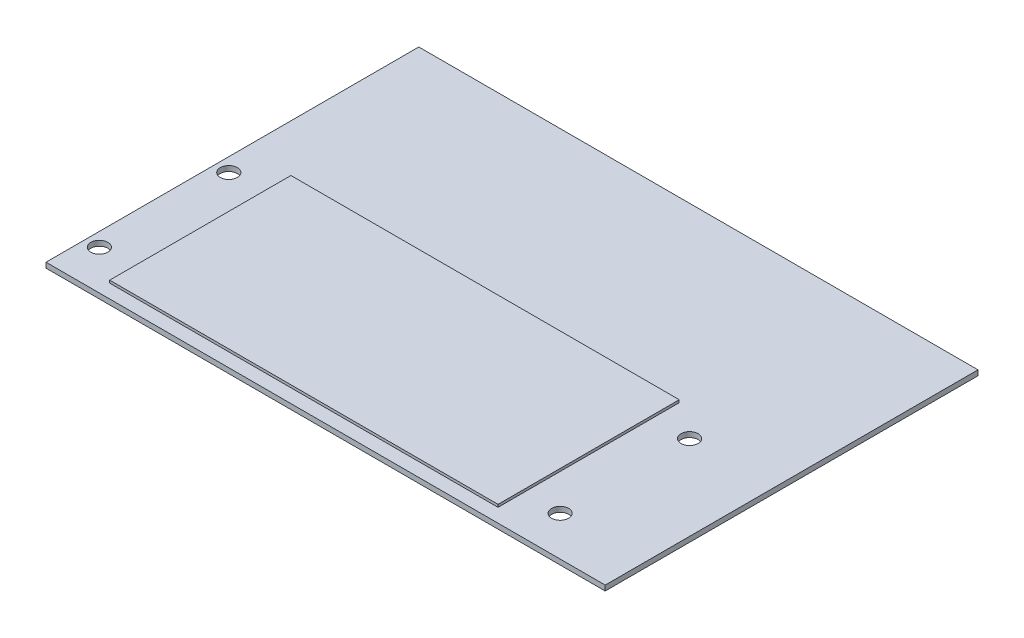
ISO-10303-21;
HEADER;
FILE_DESCRIPTION(('STEP AP214'),'2;1');
FILE_NAME('part.step','',(''),(''),'','','');
FILE_SCHEMA(('AUTOMOTIVE_DESIGN { 1 0 10303 214 1 1 1 1 }'));
ENDSEC;
DATA;
#1=APPLICATION_CONTEXT('core data for automotive mechanical design processes');
#2=APPLICATION_PROTOCOL_DEFINITION('international standard','automotive_design',2000,#1);
#3=PRODUCT_CONTEXT('',#1,'mechanical');
#4=PRODUCT('Part','Part','',(#3));
#5=PRODUCT_RELATED_PRODUCT_CATEGORY('part','',(#4));
#6=PRODUCT_DEFINITION_FORMATION('','',#4);
#7=PRODUCT_DEFINITION_CONTEXT('part definition',#1,'design');
#8=PRODUCT_DEFINITION('design','',#6,#7);
#9=PRODUCT_DEFINITION_SHAPE('','',#8);
#10=(LENGTH_UNIT() NAMED_UNIT(*) SI_UNIT(.MILLI.,.METRE.));
#11=(NAMED_UNIT(*) PLANE_ANGLE_UNIT() SI_UNIT($,.RADIAN.));
#12=(NAMED_UNIT(*) SI_UNIT($,.STERADIAN.) SOLID_ANGLE_UNIT());
#13=UNCERTAINTY_MEASURE_WITH_UNIT(LENGTH_MEASURE(1.E-05),#10,'distance_accuracy_value','');
#14=(GEOMETRIC_REPRESENTATION_CONTEXT(3) GLOBAL_UNCERTAINTY_ASSIGNED_CONTEXT((#13)) GLOBAL_UNIT_ASSIGNED_CONTEXT((#10,
#11,#12)) REPRESENTATION_CONTEXT('',''));
#15=CARTESIAN_POINT('',(0.,0.,0.));
#16=DIRECTION('',(0.,0.,1.));
#17=DIRECTION('',(1.,0.,0.));
#18=AXIS2_PLACEMENT_3D('',#15,#16,#17);
#19=CARTESIAN_POINT('',(0.,1.,0.));
#20=DIRECTION('',(0.,1.,0.));
#21=DIRECTION('',(0.,0.,1.));
#22=AXIS2_PLACEMENT_3D('',#19,#20,#21);
#23=PLANE('',#22);
#24=CARTESIAN_POINT('',(44.5,1.,-12.5));
#25=DIRECTION('',(0.,1.,0.));
#26=DIRECTION('',(0.,0.,1.));
#27=AXIS2_PLACEMENT_3D('',#24,#25,#26);
#28=CIRCLE('',#27,1.65);
#29=CARTESIAN_POINT('',(44.5,1.,-10.85));
#30=VERTEX_POINT('',#29);
#31=EDGE_CURVE('E146',#30,#30,#28,.T.);
#32=ORIENTED_EDGE('',*,*,#31,.F.);
#33=EDGE_LOOP('',(#32));
#34=FACE_BOUND('',#33,.T.);
#35=CARTESIAN_POINT('',(-44.5,1.,-12.5));
#36=DIRECTION('',(0.,1.,0.));
#37=DIRECTION('',(0.,0.,1.));
#38=AXIS2_PLACEMENT_3D('',#35,#36,#37);
#39=CIRCLE('',#38,1.65);
#40=CARTESIAN_POINT('',(-44.5,1.,-10.85));
#41=VERTEX_POINT('',#40);
#42=EDGE_CURVE('E158',#41,#41,#39,.T.);
#43=ORIENTED_EDGE('',*,*,#42,.F.);
#44=EDGE_LOOP('',(#43));
#45=FACE_BOUND('',#44,.T.);
#46=DIRECTION('',(0.,0.,1.));
#47=VECTOR('',#46,1.);
#48=CARTESIAN_POINT('',(-47.15,1.,-51.85));
#49=LINE('',#48,#47);
#50=CARTESIAN_POINT('',(-47.15,1.,-51.85));
#51=VERTEX_POINT('',#50);
#52=CARTESIAN_POINT('',(-47.15,1.,20.15));
#53=VERTEX_POINT('',#52);
#54=EDGE_CURVE('E164',#51,#53,#49,.T.);
#55=ORIENTED_EDGE('',*,*,#54,.T.);
#56=DIRECTION('',(1.,0.,0.));
#57=VECTOR('',#56,1.);
#58=CARTESIAN_POINT('',(-47.15,1.,20.15));
#59=LINE('',#58,#57);
#60=CARTESIAN_POINT('',(60.85,1.,20.15));
#61=VERTEX_POINT('',#60);
#62=EDGE_CURVE('E88',#53,#61,#59,.T.);
#63=ORIENTED_EDGE('',*,*,#62,.T.);
#64=DIRECTION('',(0.,0.,-1.));
#65=VECTOR('',#64,1.);
#66=CARTESIAN_POINT('',(60.85,1.,-51.85));
#67=LINE('',#66,#65);
#68=CARTESIAN_POINT('',(60.85,1.,-51.85));
#69=VERTEX_POINT('',#68);
#70=EDGE_CURVE('E167',#61,#69,#67,.T.);
#71=ORIENTED_EDGE('',*,*,#70,.T.);
#72=DIRECTION('',(-1.,0.,0.));
#73=VECTOR('',#72,1.);
#74=CARTESIAN_POINT('',(-47.15,1.,-51.85));
#75=LINE('',#74,#73);
#76=EDGE_CURVE('E60',#69,#51,#75,.T.);
#77=ORIENTED_EDGE('',*,*,#76,.T.);
#78=EDGE_LOOP('',(#55,#63,#71,#77));
#79=FACE_BOUND('',#78,.T.);
#80=CARTESIAN_POINT('',(-44.5,1.,12.5));
#81=DIRECTION('',(0.,1.,0.));
#82=DIRECTION('',(0.,0.,1.));
#83=AXIS2_PLACEMENT_3D('',#80,#81,#82);
#84=CIRCLE('',#83,1.64999999999999);
#85=CARTESIAN_POINT('',(-44.5,1.,14.15));
#86=VERTEX_POINT('',#85);
#87=EDGE_CURVE('E152',#86,#86,#84,.T.);
#88=ORIENTED_EDGE('',*,*,#87,.F.);
#89=EDGE_LOOP('',(#88));
#90=FACE_BOUND('',#89,.T.);
#91=CARTESIAN_POINT('',(44.5,1.,12.5));
#92=DIRECTION('',(0.,1.,0.));
#93=DIRECTION('',(0.,0.,1.));
#94=AXIS2_PLACEMENT_3D('',#91,#92,#93);
#95=CIRCLE('',#94,1.64999999999999);
#96=CARTESIAN_POINT('',(44.5,1.,14.15));
#97=VERTEX_POINT('',#96);
#98=EDGE_CURVE('E138',#97,#97,#95,.T.);
#99=ORIENTED_EDGE('',*,*,#98,.F.);
#100=EDGE_LOOP('',(#99));
#101=FACE_BOUND('',#100,.T.);
#102=DIRECTION('',(1.,0.,0.));
#103=VECTOR('',#102,1.);
#104=CARTESIAN_POINT('',(37.5,1.,17.5));
#105=LINE('',#104,#103);
#106=CARTESIAN_POINT('',(-37.5,1.,17.5));
#107=VERTEX_POINT('',#106);
#108=CARTESIAN_POINT('',(37.5,1.,17.5));
#109=VERTEX_POINT('',#108);
#110=EDGE_CURVE('E334',#107,#109,#105,.T.);
#111=ORIENTED_EDGE('',*,*,#110,.F.);
#112=DIRECTION('',(0.,0.,1.));
#113=VECTOR('',#112,1.);
#114=CARTESIAN_POINT('',(-37.5,1.,-17.5));
#115=LINE('',#114,#113);
#116=CARTESIAN_POINT('',(-37.5,1.,-17.5));
#117=VERTEX_POINT('',#116);
#118=EDGE_CURVE('E133',#117,#107,#115,.T.);
#119=ORIENTED_EDGE('',*,*,#118,.F.);
#120=DIRECTION('',(-1.,0.,0.));
#121=VECTOR('',#120,1.);
#122=CARTESIAN_POINT('',(37.5,1.,-17.5));
#123=LINE('',#122,#121);
#124=CARTESIAN_POINT('',(37.5,1.,-17.5));
#125=VERTEX_POINT('',#124);
#126=EDGE_CURVE('E129',#125,#117,#123,.T.);
#127=ORIENTED_EDGE('',*,*,#126,.F.);
#128=DIRECTION('',(0.,0.,-1.));
#129=VECTOR('',#128,1.);
#130=CARTESIAN_POINT('',(37.5,1.,-17.5));
#131=LINE('',#130,#129);
#132=EDGE_CURVE('E331',#109,#125,#131,.T.);
#133=ORIENTED_EDGE('',*,*,#132,.F.);
#134=EDGE_LOOP('',(#111,#119,#127,#133));
#135=FACE_BOUND('',#134,.T.);
#136=ADVANCED_FACE('F36',(#34,#45,#79,#90,#101,#135),#23,.T.);
#137=CARTESIAN_POINT('',(0.,0.,0.));
#138=DIRECTION('',(0.,1.,0.));
#139=DIRECTION('',(0.,0.,1.));
#140=AXIS2_PLACEMENT_3D('',#137,#138,#139);
#141=PLANE('',#140);
#142=DIRECTION('',(0.,0.,1.));
#143=VECTOR('',#142,1.);
#144=CARTESIAN_POINT('',(-47.15,0.,-51.85));
#145=LINE('',#144,#143);
#146=CARTESIAN_POINT('',(-47.15,0.,-51.85));
#147=VERTEX_POINT('',#146);
#148=CARTESIAN_POINT('',(-47.15,0.,20.15));
#149=VERTEX_POINT('',#148);
#150=EDGE_CURVE('E161',#147,#149,#145,.T.);
#151=ORIENTED_EDGE('',*,*,#150,.F.);
#152=DIRECTION('',(-1.,0.,0.));
#153=VECTOR('',#152,1.);
#154=CARTESIAN_POINT('',(-47.15,0.,-51.85));
#155=LINE('',#154,#153);
#156=CARTESIAN_POINT('',(60.85,0.,-51.85));
#157=VERTEX_POINT('',#156);
#158=EDGE_CURVE('E81',#157,#147,#155,.T.);
#159=ORIENTED_EDGE('',*,*,#158,.F.);
#160=DIRECTION('',(0.,0.,-1.));
#161=VECTOR('',#160,1.);
#162=CARTESIAN_POINT('',(60.85,0.,-51.85));
#163=LINE('',#162,#161);
#164=CARTESIAN_POINT('',(60.85,0.,20.15));
#165=VERTEX_POINT('',#164);
#166=EDGE_CURVE('E175',#165,#157,#163,.T.);
#167=ORIENTED_EDGE('',*,*,#166,.F.);
#168=DIRECTION('',(1.,0.,0.));
#169=VECTOR('',#168,1.);
#170=CARTESIAN_POINT('',(-47.15,0.,20.15));
#171=LINE('',#170,#169);
#172=EDGE_CURVE('E173',#149,#165,#171,.T.);
#173=ORIENTED_EDGE('',*,*,#172,.F.);
#174=EDGE_LOOP('',(#151,#159,#167,#173));
#175=FACE_BOUND('',#174,.T.);
#176=CARTESIAN_POINT('',(-44.5,0.,-12.5));
#177=DIRECTION('',(0.,1.,0.));
#178=DIRECTION('',(0.,0.,1.));
#179=AXIS2_PLACEMENT_3D('',#176,#177,#178);
#180=CIRCLE('',#179,1.65);
#181=CARTESIAN_POINT('',(-44.5,0.,-10.85));
#182=VERTEX_POINT('',#181);
#183=EDGE_CURVE('E155',#182,#182,#180,.T.);
#184=ORIENTED_EDGE('',*,*,#183,.T.);
#185=EDGE_LOOP('',(#184));
#186=FACE_BOUND('',#185,.T.);
#187=CARTESIAN_POINT('',(-44.5,0.,12.5));
#188=DIRECTION('',(0.,1.,0.));
#189=DIRECTION('',(0.,0.,1.));
#190=AXIS2_PLACEMENT_3D('',#187,#188,#189);
#191=CIRCLE('',#190,1.64999999999999);
#192=CARTESIAN_POINT('',(-44.5,0.,14.15));
#193=VERTEX_POINT('',#192);
#194=EDGE_CURVE('E149',#193,#193,#191,.T.);
#195=ORIENTED_EDGE('',*,*,#194,.T.);
#196=EDGE_LOOP('',(#195));
#197=FACE_BOUND('',#196,.T.);
#198=CARTESIAN_POINT('',(44.5,0.,-12.5));
#199=DIRECTION('',(0.,1.,0.));
#200=DIRECTION('',(0.,0.,1.));
#201=AXIS2_PLACEMENT_3D('',#198,#199,#200);
#202=CIRCLE('',#201,1.65);
#203=CARTESIAN_POINT('',(44.5,0.,-10.85));
#204=VERTEX_POINT('',#203);
#205=EDGE_CURVE('E144',#204,#204,#202,.T.);
#206=ORIENTED_EDGE('',*,*,#205,.T.);
#207=EDGE_LOOP('',(#206));
#208=FACE_BOUND('',#207,.T.);
#209=CARTESIAN_POINT('',(44.5,0.,12.5));
#210=DIRECTION('',(0.,1.,0.));
#211=DIRECTION('',(0.,0.,1.));
#212=AXIS2_PLACEMENT_3D('',#209,#210,#211);
#213=CIRCLE('',#212,1.64999999999999);
#214=CARTESIAN_POINT('',(44.5,0.,14.15));
#215=VERTEX_POINT('',#214);
#216=EDGE_CURVE('E135',#215,#215,#213,.T.);
#217=ORIENTED_EDGE('',*,*,#216,.T.);
#218=EDGE_LOOP('',(#217));
#219=FACE_BOUND('',#218,.T.);
#220=ADVANCED_FACE('F188',(#175,#186,#197,#208,#219),#141,.F.);
#221=CARTESIAN_POINT('',(-47.15,1.,-51.85));
#222=DIRECTION('',(1.,0.,0.));
#223=DIRECTION('',(0.,0.,-1.));
#224=AXIS2_PLACEMENT_3D('',#221,#222,#223);
#225=PLANE('',#224);
#226=ORIENTED_EDGE('',*,*,#150,.T.);
#227=DIRECTION('',(0.,-1.,0.));
#228=VECTOR('',#227,1.);
#229=CARTESIAN_POINT('',(-47.15,1.,20.15));
#230=LINE('',#229,#228);
#231=EDGE_CURVE('E11',#53,#149,#230,.T.);
#232=ORIENTED_EDGE('',*,*,#231,.F.);
#233=ORIENTED_EDGE('',*,*,#54,.F.);
#234=DIRECTION('',(0.,-1.,0.));
#235=VECTOR('',#234,1.);
#236=CARTESIAN_POINT('',(-47.15,1.,-51.85));
#237=LINE('',#236,#235);
#238=EDGE_CURVE('E170',#51,#147,#237,.T.);
#239=ORIENTED_EDGE('',*,*,#238,.T.);
#240=EDGE_LOOP('',(#226,#232,#233,#239));
#241=FACE_BOUND('',#240,.T.);
#242=ADVANCED_FACE('F38',(#241),#225,.F.);
#243=CARTESIAN_POINT('',(-47.15,1.,20.15));
#244=DIRECTION('',(0.,0.,-1.));
#245=DIRECTION('',(-1.,0.,0.));
#246=AXIS2_PLACEMENT_3D('',#243,#244,#245);
#247=PLANE('',#246);
#248=ORIENTED_EDGE('',*,*,#172,.T.);
#249=DIRECTION('',(0.,-1.,0.));
#250=VECTOR('',#249,1.);
#251=CARTESIAN_POINT('',(60.85,1.,20.15));
#252=LINE('',#251,#250);
#253=EDGE_CURVE('E44',#61,#165,#252,.T.);
#254=ORIENTED_EDGE('',*,*,#253,.F.);
#255=ORIENTED_EDGE('',*,*,#62,.F.);
#256=ORIENTED_EDGE('',*,*,#231,.T.);
#257=EDGE_LOOP('',(#248,#254,#255,#256));
#258=FACE_BOUND('',#257,.T.);
#259=ADVANCED_FACE('F204',(#258),#247,.F.);
#260=CARTESIAN_POINT('',(60.85,1.,-51.85));
#261=DIRECTION('',(-1.,0.,0.));
#262=DIRECTION('',(0.,0.,1.));
#263=AXIS2_PLACEMENT_3D('',#260,#261,#262);
#264=PLANE('',#263);
#265=ORIENTED_EDGE('',*,*,#166,.T.);
#266=DIRECTION('',(0.,-1.,0.));
#267=VECTOR('',#266,1.);
#268=CARTESIAN_POINT('',(60.85,1.,-51.85));
#269=LINE('',#268,#267);
#270=EDGE_CURVE('E179',#69,#157,#269,.T.);
#271=ORIENTED_EDGE('',*,*,#270,.F.);
#272=ORIENTED_EDGE('',*,*,#70,.F.);
#273=ORIENTED_EDGE('',*,*,#253,.T.);
#274=EDGE_LOOP('',(#265,#271,#272,#273));
#275=FACE_BOUND('',#274,.T.);
#276=ADVANCED_FACE('F184',(#275),#264,.F.);
#277=CARTESIAN_POINT('',(-47.15,1.,-51.85));
#278=DIRECTION('',(0.,0.,1.));
#279=DIRECTION('',(1.,0.,0.));
#280=AXIS2_PLACEMENT_3D('',#277,#278,#279);
#281=PLANE('',#280);
#282=ORIENTED_EDGE('',*,*,#158,.T.);
#283=ORIENTED_EDGE('',*,*,#238,.F.);
#284=ORIENTED_EDGE('',*,*,#76,.F.);
#285=ORIENTED_EDGE('',*,*,#270,.T.);
#286=EDGE_LOOP('',(#282,#283,#284,#285));
#287=FACE_BOUND('',#286,.T.);
#288=ADVANCED_FACE('F193',(#287),#281,.F.);
#289=CARTESIAN_POINT('',(-44.5,1.,-12.5));
#290=DIRECTION('',(0.,-1.,0.));
#291=DIRECTION('',(0.,0.,-1.));
#292=AXIS2_PLACEMENT_3D('',#289,#290,#291);
#293=CYLINDRICAL_SURFACE('',#292,1.65);
#294=ORIENTED_EDGE('',*,*,#42,.T.);
#295=EDGE_LOOP('',(#294));
#296=FACE_BOUND('',#295,.T.);
#297=ORIENTED_EDGE('',*,*,#183,.F.);
#298=EDGE_LOOP('',(#297));
#299=FACE_BOUND('',#298,.T.);
#300=ADVANCED_FACE('F195',(#296,#299),#293,.F.);
#301=CARTESIAN_POINT('',(-44.5,1.,12.5));
#302=DIRECTION('',(0.,-1.,0.));
#303=DIRECTION('',(0.,0.,-1.));
#304=AXIS2_PLACEMENT_3D('',#301,#302,#303);
#305=CYLINDRICAL_SURFACE('',#304,1.64999999999999);
#306=ORIENTED_EDGE('',*,*,#87,.T.);
#307=EDGE_LOOP('',(#306));
#308=FACE_BOUND('',#307,.T.);
#309=ORIENTED_EDGE('',*,*,#194,.F.);
#310=EDGE_LOOP('',(#309));
#311=FACE_BOUND('',#310,.T.);
#312=ADVANCED_FACE('F201',(#308,#311),#305,.F.);
#313=CARTESIAN_POINT('',(44.5,1.,-12.5));
#314=DIRECTION('',(0.,-1.,0.));
#315=DIRECTION('',(0.,0.,-1.));
#316=AXIS2_PLACEMENT_3D('',#313,#314,#315);
#317=CYLINDRICAL_SURFACE('',#316,1.65);
#318=ORIENTED_EDGE('',*,*,#31,.T.);
#319=EDGE_LOOP('',(#318));
#320=FACE_BOUND('',#319,.T.);
#321=ORIENTED_EDGE('',*,*,#205,.F.);
#322=EDGE_LOOP('',(#321));
#323=FACE_BOUND('',#322,.T.);
#324=ADVANCED_FACE('F218',(#320,#323),#317,.F.);
#325=CARTESIAN_POINT('',(44.5,1.,12.5));
#326=DIRECTION('',(0.,-1.,0.));
#327=DIRECTION('',(0.,0.,-1.));
#328=AXIS2_PLACEMENT_3D('',#325,#326,#327);
#329=CYLINDRICAL_SURFACE('',#328,1.64999999999999);
#330=ORIENTED_EDGE('',*,*,#98,.T.);
#331=EDGE_LOOP('',(#330));
#332=FACE_BOUND('',#331,.T.);
#333=ORIENTED_EDGE('',*,*,#216,.F.);
#334=EDGE_LOOP('',(#333));
#335=FACE_BOUND('',#334,.T.);
#336=ADVANCED_FACE('F222',(#332,#335),#329,.F.);
#337=CARTESIAN_POINT('',(-37.5,1.5,-17.5));
#338=DIRECTION('',(1.,0.,0.));
#339=DIRECTION('',(0.,0.,-1.));
#340=AXIS2_PLACEMENT_3D('',#337,#338,#339);
#341=PLANE('',#340);
#342=ORIENTED_EDGE('',*,*,#118,.T.);
#343=DIRECTION('',(0.,-1.,0.));
#344=VECTOR('',#343,1.);
#345=CARTESIAN_POINT('',(-37.5,1.5,17.5));
#346=LINE('',#345,#344);
#347=CARTESIAN_POINT('',(-37.5,1.5,17.5));
#348=VERTEX_POINT('',#347);
#349=EDGE_CURVE('E114',#348,#107,#346,.T.);
#350=ORIENTED_EDGE('',*,*,#349,.F.);
#351=DIRECTION('',(0.,0.,1.));
#352=VECTOR('',#351,1.);
#353=CARTESIAN_POINT('',(-37.5,1.5,-17.5));
#354=LINE('',#353,#352);
#355=CARTESIAN_POINT('',(-37.5,1.5,-17.5));
#356=VERTEX_POINT('',#355);
#357=EDGE_CURVE('E121',#356,#348,#354,.T.);
#358=ORIENTED_EDGE('',*,*,#357,.F.);
#359=DIRECTION('',(0.,-1.,0.));
#360=VECTOR('',#359,1.);
#361=CARTESIAN_POINT('',(-37.5,1.5,-17.5));
#362=LINE('',#361,#360);
#363=EDGE_CURVE('E328',#356,#117,#362,.T.);
#364=ORIENTED_EDGE('',*,*,#363,.T.);
#365=EDGE_LOOP('',(#342,#350,#358,#364));
#366=FACE_BOUND('',#365,.T.);
#367=ADVANCED_FACE('F131',(#366),#341,.F.);
#368=CARTESIAN_POINT('',(37.5,1.5,17.5));
#369=DIRECTION('',(0.,0.,-1.));
#370=DIRECTION('',(-1.,0.,0.));
#371=AXIS2_PLACEMENT_3D('',#368,#369,#370);
#372=PLANE('',#371);
#373=ORIENTED_EDGE('',*,*,#110,.T.);
#374=DIRECTION('',(0.,-1.,0.));
#375=VECTOR('',#374,1.);
#376=CARTESIAN_POINT('',(37.5,1.5,17.5));
#377=LINE('',#376,#375);
#378=CARTESIAN_POINT('',(37.5,1.5,17.5));
#379=VERTEX_POINT('',#378);
#380=EDGE_CURVE('E117',#379,#109,#377,.T.);
#381=ORIENTED_EDGE('',*,*,#380,.F.);
#382=DIRECTION('',(1.,0.,0.));
#383=VECTOR('',#382,1.);
#384=CARTESIAN_POINT('',(37.5,1.5,17.5));
#385=LINE('',#384,#383);
#386=EDGE_CURVE('E110',#348,#379,#385,.T.);
#387=ORIENTED_EDGE('',*,*,#386,.F.);
#388=ORIENTED_EDGE('',*,*,#349,.T.);
#389=EDGE_LOOP('',(#373,#381,#387,#388));
#390=FACE_BOUND('',#389,.T.);
#391=ADVANCED_FACE('F112',(#390),#372,.F.);
#392=CARTESIAN_POINT('',(37.5,1.5,-17.5));
#393=DIRECTION('',(-1.,0.,0.));
#394=DIRECTION('',(0.,0.,1.));
#395=AXIS2_PLACEMENT_3D('',#392,#393,#394);
#396=PLANE('',#395);
#397=ORIENTED_EDGE('',*,*,#132,.T.);
#398=DIRECTION('',(0.,-1.,0.));
#399=VECTOR('',#398,1.);
#400=CARTESIAN_POINT('',(37.5,1.5,-17.5));
#401=LINE('',#400,#399);
#402=CARTESIAN_POINT('',(37.5,1.5,-17.5));
#403=VERTEX_POINT('',#402);
#404=EDGE_CURVE('E51',#403,#125,#401,.T.);
#405=ORIENTED_EDGE('',*,*,#404,.F.);
#406=DIRECTION('',(0.,0.,-1.));
#407=VECTOR('',#406,1.);
#408=CARTESIAN_POINT('',(37.5,1.5,-17.5));
#409=LINE('',#408,#407);
#410=EDGE_CURVE('E120',#379,#403,#409,.T.);
#411=ORIENTED_EDGE('',*,*,#410,.F.);
#412=ORIENTED_EDGE('',*,*,#380,.T.);
#413=EDGE_LOOP('',(#397,#405,#411,#412));
#414=FACE_BOUND('',#413,.T.);
#415=ADVANCED_FACE('F231',(#414),#396,.F.);
#416=CARTESIAN_POINT('',(37.5,1.5,-17.5));
#417=DIRECTION('',(0.,0.,1.));
#418=DIRECTION('',(1.,0.,0.));
#419=AXIS2_PLACEMENT_3D('',#416,#417,#418);
#420=PLANE('',#419);
#421=ORIENTED_EDGE('',*,*,#126,.T.);
#422=ORIENTED_EDGE('',*,*,#363,.F.);
#423=DIRECTION('',(-1.,0.,0.));
#424=VECTOR('',#423,1.);
#425=CARTESIAN_POINT('',(37.5,1.5,-17.5));
#426=LINE('',#425,#424);
#427=EDGE_CURVE('E125',#403,#356,#426,.T.);
#428=ORIENTED_EDGE('',*,*,#427,.F.);
#429=ORIENTED_EDGE('',*,*,#404,.T.);
#430=EDGE_LOOP('',(#421,#422,#428,#429));
#431=FACE_BOUND('',#430,.T.);
#432=ADVANCED_FACE('F234',(#431),#420,.F.);
#433=CARTESIAN_POINT('',(0.,1.5,0.));
#434=DIRECTION('',(0.,-1.,0.));
#435=DIRECTION('',(0.,0.,-1.));
#436=AXIS2_PLACEMENT_3D('',#433,#434,#435);
#437=PLANE('',#436);
#438=ORIENTED_EDGE('',*,*,#357,.T.);
#439=ORIENTED_EDGE('',*,*,#386,.T.);
#440=ORIENTED_EDGE('',*,*,#410,.T.);
#441=ORIENTED_EDGE('',*,*,#427,.T.);
#442=EDGE_LOOP('',(#438,#439,#440,#441));
#443=FACE_BOUND('',#442,.T.);
#444=ADVANCED_FACE('F124',(#443),#437,.F.);
#445=CLOSED_SHELL('',(#136,#220,#242,#259,#276,#288,#300,#312,#324,#336,#367,#391,#415,#432,#444));
#446=MANIFOLD_SOLID_BREP('B2',#445);
#447=ADVANCED_BREP_SHAPE_REPRESENTATION('',(#18,#446),#14);
#448=SHAPE_DEFINITION_REPRESENTATION(#9,#447);
ENDSEC;
END-ISO-10303-21;
